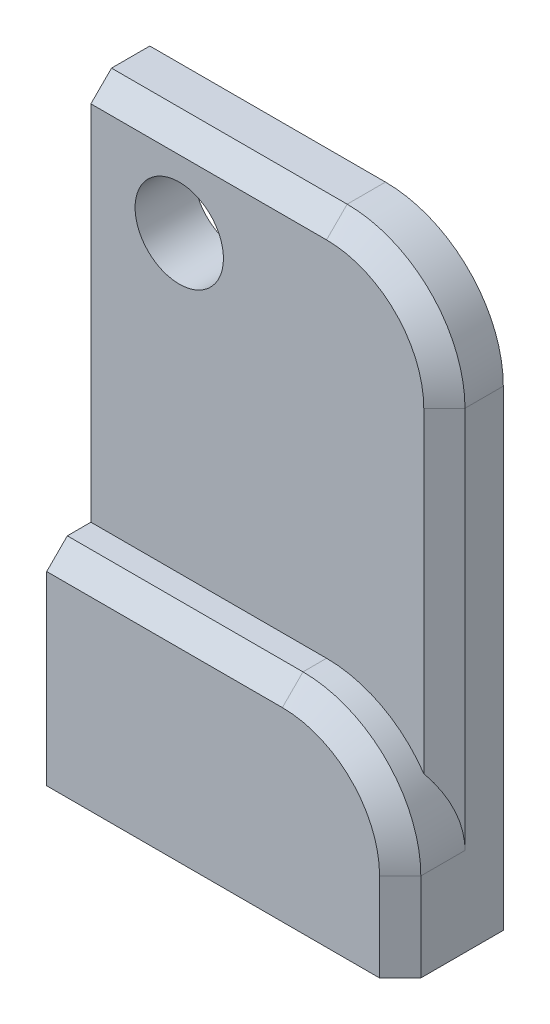
ISO-10303-21;
HEADER;
FILE_DESCRIPTION(('STEP AP214'),'2;1');
FILE_NAME('part.step','',(''),(''),'','','');
FILE_SCHEMA(('AUTOMOTIVE_DESIGN { 1 0 10303 214 1 1 1 1 }'));
ENDSEC;
DATA;
#1=APPLICATION_CONTEXT('core data for automotive mechanical design processes');
#2=APPLICATION_PROTOCOL_DEFINITION('international standard','automotive_design',2000,#1);
#3=PRODUCT_CONTEXT('',#1,'mechanical');
#4=PRODUCT('Part','Part','',(#3));
#5=PRODUCT_RELATED_PRODUCT_CATEGORY('part','',(#4));
#6=PRODUCT_DEFINITION_FORMATION('','',#4);
#7=PRODUCT_DEFINITION_CONTEXT('part definition',#1,'design');
#8=PRODUCT_DEFINITION('design','',#6,#7);
#9=PRODUCT_DEFINITION_SHAPE('','',#8);
#10=(LENGTH_UNIT() NAMED_UNIT(*) SI_UNIT(.MILLI.,.METRE.));
#11=(NAMED_UNIT(*) PLANE_ANGLE_UNIT() SI_UNIT($,.RADIAN.));
#12=(NAMED_UNIT(*) SI_UNIT($,.STERADIAN.) SOLID_ANGLE_UNIT());
#13=UNCERTAINTY_MEASURE_WITH_UNIT(LENGTH_MEASURE(1.E-05),#10,'distance_accuracy_value','');
#14=(GEOMETRIC_REPRESENTATION_CONTEXT(3) GLOBAL_UNCERTAINTY_ASSIGNED_CONTEXT((#13)) GLOBAL_UNIT_ASSIGNED_CONTEXT((#10,
#11,#12)) REPRESENTATION_CONTEXT('',''));
#15=CARTESIAN_POINT('',(0.,0.,0.));
#16=DIRECTION('',(0.,0.,1.));
#17=DIRECTION('',(1.,0.,0.));
#18=AXIS2_PLACEMENT_3D('',#15,#16,#17);
#19=CARTESIAN_POINT('',(0.,0.,0.));
#20=DIRECTION('',(0.,0.,-1.));
#21=DIRECTION('',(-1.,0.,0.));
#22=AXIS2_PLACEMENT_3D('',#19,#20,#21);
#23=PLANE('',#22);
#24=DIRECTION('',(1.,0.,0.));
#25=VECTOR('',#24,1.);
#26=CARTESIAN_POINT('',(-60.,-100.,0.));
#27=LINE('',#26,#25);
#28=CARTESIAN_POINT('',(55.,-100.,0.));
#29=VERTEX_POINT('',#28);
#30=CARTESIAN_POINT('',(60.,-100.,0.));
#31=VERTEX_POINT('',#30);
#32=EDGE_CURVE('E330',#29,#31,#27,.T.);
#33=ORIENTED_EDGE('',*,*,#32,.F.);
#34=DIRECTION('',(0.,1.,0.));
#35=VECTOR('',#34,1.);
#36=CARTESIAN_POINT('',(55.,0.,0.));
#37=LINE('',#36,#35);
#38=CARTESIAN_POINT('',(55.,60.,0.));
#39=VERTEX_POINT('',#38);
#40=EDGE_CURVE('E257',#29,#39,#37,.T.);
#41=ORIENTED_EDGE('',*,*,#40,.T.);
#42=CARTESIAN_POINT('',(20.,60.,0.));
#43=DIRECTION('',(0.,0.,-1.));
#44=DIRECTION('',(-1.,0.,0.));
#45=AXIS2_PLACEMENT_3D('',#42,#43,#44);
#46=CIRCLE('',#45,35.);
#47=CARTESIAN_POINT('',(20.,95.,0.));
#48=VERTEX_POINT('',#47);
#49=EDGE_CURVE('E258',#48,#39,#46,.T.);
#50=ORIENTED_EDGE('',*,*,#49,.F.);
#51=DIRECTION('',(-1.,0.,0.));
#52=VECTOR('',#51,1.);
#53=CARTESIAN_POINT('',(0.,95.,0.));
#54=LINE('',#53,#52);
#55=CARTESIAN_POINT('',(-55.,95.,0.));
#56=VERTEX_POINT('',#55);
#57=EDGE_CURVE('E253',#48,#56,#54,.T.);
#58=ORIENTED_EDGE('',*,*,#57,.T.);
#59=DIRECTION('',(0.,-1.,0.));
#60=VECTOR('',#59,1.);
#61=CARTESIAN_POINT('',(-55.,0.,0.));
#62=LINE('',#61,#60);
#63=CARTESIAN_POINT('',(-55.,-100.,0.));
#64=VERTEX_POINT('',#63);
#65=EDGE_CURVE('E250',#56,#64,#62,.T.);
#66=ORIENTED_EDGE('',*,*,#65,.T.);
#67=CARTESIAN_POINT('',(-60.,-100.,0.));
#68=VERTEX_POINT('',#67);
#69=EDGE_CURVE('E319',#68,#64,#27,.T.);
#70=ORIENTED_EDGE('',*,*,#69,.F.);
#71=DIRECTION('',(0.,-1.,0.));
#72=VECTOR('',#71,1.);
#73=CARTESIAN_POINT('',(-60.,-100.,0.));
#74=LINE('',#73,#72);
#75=CARTESIAN_POINT('',(-60.,100.,0.));
#76=VERTEX_POINT('',#75);
#77=EDGE_CURVE('E327',#76,#68,#74,.T.);
#78=ORIENTED_EDGE('',*,*,#77,.F.);
#79=DIRECTION('',(-1.,0.,0.));
#80=VECTOR('',#79,1.);
#81=CARTESIAN_POINT('',(-60.,100.,0.));
#82=LINE('',#81,#80);
#83=CARTESIAN_POINT('',(20.,100.,0.));
#84=VERTEX_POINT('',#83);
#85=EDGE_CURVE('E323',#84,#76,#82,.T.);
#86=ORIENTED_EDGE('',*,*,#85,.F.);
#87=CARTESIAN_POINT('',(20.,60.,0.));
#88=DIRECTION('',(0.,0.,-1.));
#89=DIRECTION('',(-1.,0.,0.));
#90=AXIS2_PLACEMENT_3D('',#87,#88,#89);
#91=CIRCLE('',#90,40.);
#92=CARTESIAN_POINT('',(60.,60.,0.));
#93=VERTEX_POINT('',#92);
#94=EDGE_CURVE('E358',#84,#93,#91,.T.);
#95=ORIENTED_EDGE('',*,*,#94,.T.);
#96=DIRECTION('',(0.,1.,0.));
#97=VECTOR('',#96,1.);
#98=CARTESIAN_POINT('',(60.,-100.,0.));
#99=LINE('',#98,#97);
#100=EDGE_CURVE('E314',#31,#93,#99,.T.);
#101=ORIENTED_EDGE('',*,*,#100,.F.);
#102=EDGE_LOOP('',(#33,#41,#50,#58,#66,#70,#78,#86,#95,#101));
#103=FACE_BOUND('',#102,.T.);
#104=ADVANCED_FACE('F47',(#103),#23,.T.);
#105=CARTESIAN_POINT('',(0.,0.,20.));
#106=DIRECTION('',(0.,0.,-1.));
#107=DIRECTION('',(-1.,0.,0.));
#108=AXIS2_PLACEMENT_3D('',#105,#106,#107);
#109=PLANE('',#108);
#110=CARTESIAN_POINT('',(-30.,70.,20.));
#111=DIRECTION('',(0.,0.,1.));
#112=DIRECTION('',(1.,0.,0.));
#113=AXIS2_PLACEMENT_3D('',#110,#111,#112);
#114=CIRCLE('',#113,15.);
#115=CARTESIAN_POINT('',(-15.,70.,20.));
#116=VERTEX_POINT('',#115);
#117=EDGE_CURVE('E295',#116,#116,#114,.T.);
#118=ORIENTED_EDGE('',*,*,#117,.F.);
#119=EDGE_LOOP('',(#118));
#120=FACE_BOUND('',#119,.T.);
#121=CARTESIAN_POINT('',(20.,-70.,20.));
#122=DIRECTION('',(0.,0.,-1.));
#123=DIRECTION('',(-1.,0.,0.));
#124=AXIS2_PLACEMENT_3D('',#121,#122,#123);
#125=CIRCLE('',#124,40.);
#126=CARTESIAN_POINT('',(20.,-30.,20.));
#127=VERTEX_POINT('',#126);
#128=CARTESIAN_POINT('',(53.,-47.3946908890854,20.));
#129=VERTEX_POINT('',#128);
#130=EDGE_CURVE('E361',#127,#129,#125,.T.);
#131=ORIENTED_EDGE('',*,*,#130,.T.);
#132=DIRECTION('',(0.,1.,0.));
#133=VECTOR('',#132,1.);
#134=CARTESIAN_POINT('',(53.,0.,20.));
#135=LINE('',#134,#133);
#136=CARTESIAN_POINT('',(53.,60.,20.));
#137=VERTEX_POINT('',#136);
#138=EDGE_CURVE('E403',#129,#137,#135,.T.);
#139=ORIENTED_EDGE('',*,*,#138,.T.);
#140=CARTESIAN_POINT('',(20.,60.,20.));
#141=DIRECTION('',(0.,0.,-1.));
#142=DIRECTION('',(-1.,0.,0.));
#143=AXIS2_PLACEMENT_3D('',#140,#141,#142);
#144=CIRCLE('',#143,33.);
#145=CARTESIAN_POINT('',(20.,93.,20.));
#146=VERTEX_POINT('',#145);
#147=EDGE_CURVE('E400',#137,#146,#144,.F.);
#148=ORIENTED_EDGE('',*,*,#147,.T.);
#149=DIRECTION('',(-1.,0.,0.));
#150=VECTOR('',#149,1.);
#151=CARTESIAN_POINT('',(0.,93.,20.));
#152=LINE('',#151,#150);
#153=CARTESIAN_POINT('',(-60.,93.,20.));
#154=VERTEX_POINT('',#153);
#155=EDGE_CURVE('E397',#146,#154,#152,.T.);
#156=ORIENTED_EDGE('',*,*,#155,.T.);
#157=DIRECTION('',(0.,-1.,0.));
#158=VECTOR('',#157,1.);
#159=CARTESIAN_POINT('',(-60.,-100.,20.));
#160=LINE('',#159,#158);
#161=CARTESIAN_POINT('',(-60.,-30.,20.));
#162=VERTEX_POINT('',#161);
#163=EDGE_CURVE('E315',#154,#162,#160,.T.);
#164=ORIENTED_EDGE('',*,*,#163,.T.);
#165=DIRECTION('',(-1.,0.,0.));
#166=VECTOR('',#165,1.);
#167=CARTESIAN_POINT('',(-60.,-30.,20.));
#168=LINE('',#167,#166);
#169=EDGE_CURVE('E294',#127,#162,#168,.T.);
#170=ORIENTED_EDGE('',*,*,#169,.F.);
#171=EDGE_LOOP('',(#131,#139,#148,#156,#164,#170));
#172=FACE_BOUND('',#171,.T.);
#173=ADVANCED_FACE('F534',(#120,#172),#109,.F.);
#174=CARTESIAN_POINT('',(60.,-100.,20.));
#175=DIRECTION('',(-1.,0.,0.));
#176=DIRECTION('',(0.,0.,1.));
#177=AXIS2_PLACEMENT_3D('',#174,#175,#176);
#178=PLANE('',#177);
#179=DIRECTION('',(0.,0.,-1.));
#180=VECTOR('',#179,1.);
#181=CARTESIAN_POINT('',(60.,-70.,20.));
#182=LINE('',#181,#180);
#183=CARTESIAN_POINT('',(60.,-70.,13.));
#184=VERTEX_POINT('',#183);
#185=CARTESIAN_POINT('',(60.,-70.,28.));
#186=VERTEX_POINT('',#185);
#187=EDGE_CURVE('E351',#184,#186,#182,.F.);
#188=ORIENTED_EDGE('',*,*,#187,.T.);
#189=DIRECTION('',(0.,-1.,0.));
#190=VECTOR('',#189,1.);
#191=CARTESIAN_POINT('',(60.,-100.,28.));
#192=LINE('',#191,#190);
#193=CARTESIAN_POINT('',(60.,-100.,28.));
#194=VERTEX_POINT('',#193);
#195=EDGE_CURVE('E379',#186,#194,#192,.T.);
#196=ORIENTED_EDGE('',*,*,#195,.T.);
#197=DIRECTION('',(0.,0.,-1.));
#198=VECTOR('',#197,1.);
#199=CARTESIAN_POINT('',(60.,-100.,20.));
#200=LINE('',#199,#198);
#201=EDGE_CURVE('E318',#194,#31,#200,.T.);
#202=ORIENTED_EDGE('',*,*,#201,.T.);
#203=ORIENTED_EDGE('',*,*,#100,.T.);
#204=DIRECTION('',(0.,0.,-1.));
#205=VECTOR('',#204,1.);
#206=CARTESIAN_POINT('',(60.,60.,20.));
#207=LINE('',#206,#205);
#208=CARTESIAN_POINT('',(60.,60.,13.));
#209=VERTEX_POINT('',#208);
#210=EDGE_CURVE('E347',#93,#209,#207,.F.);
#211=ORIENTED_EDGE('',*,*,#210,.T.);
#212=DIRECTION('',(0.,-1.,0.));
#213=VECTOR('',#212,1.);
#214=CARTESIAN_POINT('',(60.,-100.,13.));
#215=LINE('',#214,#213);
#216=EDGE_CURVE('E375',#209,#184,#215,.T.);
#217=ORIENTED_EDGE('',*,*,#216,.T.);
#218=EDGE_LOOP('',(#188,#196,#202,#203,#211,#217));
#219=FACE_BOUND('',#218,.T.);
#220=ADVANCED_FACE('F541',(#219),#178,.F.);
#221=CARTESIAN_POINT('',(-60.,100.,20.));
#222=DIRECTION('',(0.,-1.,0.));
#223=DIRECTION('',(0.,0.,-1.));
#224=AXIS2_PLACEMENT_3D('',#221,#222,#223);
#225=PLANE('',#224);
#226=DIRECTION('',(0.,0.,-1.));
#227=VECTOR('',#226,1.);
#228=CARTESIAN_POINT('',(-60.,100.,20.));
#229=LINE('',#228,#227);
#230=CARTESIAN_POINT('',(-60.,100.,13.));
#231=VERTEX_POINT('',#230);
#232=EDGE_CURVE('E341',#231,#76,#229,.T.);
#233=ORIENTED_EDGE('',*,*,#232,.F.);
#234=DIRECTION('',(1.,0.,0.));
#235=VECTOR('',#234,1.);
#236=CARTESIAN_POINT('',(-60.,100.,13.));
#237=LINE('',#236,#235);
#238=CARTESIAN_POINT('',(20.,100.,13.));
#239=VERTEX_POINT('',#238);
#240=EDGE_CURVE('E58',#231,#239,#237,.T.);
#241=ORIENTED_EDGE('',*,*,#240,.T.);
#242=DIRECTION('',(0.,0.,-1.));
#243=VECTOR('',#242,1.);
#244=CARTESIAN_POINT('',(20.,100.,20.));
#245=LINE('',#244,#243);
#246=EDGE_CURVE('E355',#239,#84,#245,.T.);
#247=ORIENTED_EDGE('',*,*,#246,.T.);
#248=ORIENTED_EDGE('',*,*,#85,.T.);
#249=EDGE_LOOP('',(#233,#241,#247,#248));
#250=FACE_BOUND('',#249,.T.);
#251=ADVANCED_FACE('F595',(#250),#225,.F.);
#252=CARTESIAN_POINT('',(-60.,-100.,20.));
#253=DIRECTION('',(1.,0.,0.));
#254=DIRECTION('',(0.,0.,-1.));
#255=AXIS2_PLACEMENT_3D('',#252,#253,#254);
#256=PLANE('',#255);
#257=DIRECTION('',(0.,-1.,0.));
#258=VECTOR('',#257,1.);
#259=CARTESIAN_POINT('',(-60.,-100.,35.));
#260=LINE('',#259,#258);
#261=CARTESIAN_POINT('',(-60.,-37.,35.));
#262=VERTEX_POINT('',#261);
#263=CARTESIAN_POINT('',(-60.,-100.,35.));
#264=VERTEX_POINT('',#263);
#265=EDGE_CURVE('E300',#262,#264,#260,.T.);
#266=ORIENTED_EDGE('',*,*,#265,.F.);
#267=DIRECTION('',(0.,-0.707106781186546,0.707106781186549));
#268=VECTOR('',#267,1.);
#269=CARTESIAN_POINT('',(-60.,-37.,35.));
#270=LINE('',#269,#268);
#271=CARTESIAN_POINT('',(-60.,-30.,28.));
#272=VERTEX_POINT('',#271);
#273=EDGE_CURVE('E391',#262,#272,#270,.F.);
#274=ORIENTED_EDGE('',*,*,#273,.T.);
#275=DIRECTION('',(0.,0.,-1.));
#276=VECTOR('',#275,1.);
#277=CARTESIAN_POINT('',(-60.,-30.,35.));
#278=LINE('',#277,#276);
#279=EDGE_CURVE('E307',#272,#162,#278,.T.);
#280=ORIENTED_EDGE('',*,*,#279,.T.);
#281=ORIENTED_EDGE('',*,*,#163,.F.);
#282=DIRECTION('',(0.,-0.707106781186546,0.707106781186549));
#283=VECTOR('',#282,1.);
#284=CARTESIAN_POINT('',(-60.,93.,20.));
#285=LINE('',#284,#283);
#286=EDGE_CURVE('E388',#154,#231,#285,.F.);
#287=ORIENTED_EDGE('',*,*,#286,.T.);
#288=ORIENTED_EDGE('',*,*,#232,.T.);
#289=ORIENTED_EDGE('',*,*,#77,.T.);
#290=DIRECTION('',(0.,0.,-1.));
#291=VECTOR('',#290,1.);
#292=CARTESIAN_POINT('',(-60.,-100.,20.));
#293=LINE('',#292,#291);
#294=EDGE_CURVE('E337',#264,#68,#293,.T.);
#295=ORIENTED_EDGE('',*,*,#294,.F.);
#296=EDGE_LOOP('',(#266,#274,#280,#281,#287,#288,#289,#295));
#297=FACE_BOUND('',#296,.T.);
#298=ADVANCED_FACE('F557',(#297),#256,.F.);
#299=CARTESIAN_POINT('',(-60.,-100.,20.));
#300=DIRECTION('',(0.,1.,0.));
#301=DIRECTION('',(0.,0.,1.));
#302=AXIS2_PLACEMENT_3D('',#299,#300,#301);
#303=PLANE('',#302);
#304=DIRECTION('',(0.707106781186546,0.,-0.707106781186549));
#305=VECTOR('',#304,1.);
#306=CARTESIAN_POINT('',(49.4644660940672,-100.,31.4644660940673));
#307=LINE('',#306,#305);
#308=CARTESIAN_POINT('',(55.,-100.,25.9289321881345));
#309=VERTEX_POINT('',#308);
#310=CARTESIAN_POINT('',(50.9289321881345,-100.,30.));
#311=VERTEX_POINT('',#310);
#312=EDGE_CURVE('E271',#309,#311,#307,.F.);
#313=ORIENTED_EDGE('',*,*,#312,.F.);
#314=DIRECTION('',(0.,0.,-1.));
#315=VECTOR('',#314,1.);
#316=CARTESIAN_POINT('',(55.,-100.,20.));
#317=LINE('',#316,#315);
#318=EDGE_CURVE('E267',#309,#29,#317,.T.);
#319=ORIENTED_EDGE('',*,*,#318,.T.);
#320=ORIENTED_EDGE('',*,*,#32,.T.);
#321=ORIENTED_EDGE('',*,*,#201,.F.);
#322=DIRECTION('',(0.707106781186546,0.,-0.707106781186549));
#323=VECTOR('',#322,1.);
#324=CARTESIAN_POINT('',(53.,-100.,35.));
#325=LINE('',#324,#323);
#326=CARTESIAN_POINT('',(53.,-100.,35.));
#327=VERTEX_POINT('',#326);
#328=EDGE_CURVE('E382',#194,#327,#325,.F.);
#329=ORIENTED_EDGE('',*,*,#328,.T.);
#330=DIRECTION('',(1.,0.,0.));
#331=VECTOR('',#330,1.);
#332=CARTESIAN_POINT('',(-60.,-100.,35.));
#333=LINE('',#332,#331);
#334=EDGE_CURVE('E303',#264,#327,#333,.T.);
#335=ORIENTED_EDGE('',*,*,#334,.F.);
#336=ORIENTED_EDGE('',*,*,#294,.T.);
#337=ORIENTED_EDGE('',*,*,#69,.T.);
#338=DIRECTION('',(0.,0.,-1.));
#339=VECTOR('',#338,1.);
#340=CARTESIAN_POINT('',(-55.,-100.,20.));
#341=LINE('',#340,#339);
#342=CARTESIAN_POINT('',(-55.,-100.,30.));
#343=VERTEX_POINT('',#342);
#344=EDGE_CURVE('E66',#343,#64,#341,.T.);
#345=ORIENTED_EDGE('',*,*,#344,.F.);
#346=DIRECTION('',(1.,0.,0.));
#347=VECTOR('',#346,1.);
#348=CARTESIAN_POINT('',(0.,-100.,30.));
#349=LINE('',#348,#347);
#350=EDGE_CURVE('E276',#343,#311,#349,.T.);
#351=ORIENTED_EDGE('',*,*,#350,.T.);
#352=EDGE_LOOP('',(#313,#319,#320,#321,#329,#335,#336,#337,#345,#351));
#353=FACE_BOUND('',#352,.T.);
#354=ADVANCED_FACE('F548',(#353),#303,.F.);
#355=CARTESIAN_POINT('',(-30.,70.,0.));
#356=DIRECTION('',(0.,0.,-1.));
#357=DIRECTION('',(-1.,0.,0.));
#358=AXIS2_PLACEMENT_3D('',#355,#356,#357);
#359=CIRCLE('',#358,20.);
#360=CARTESIAN_POINT('',(-50.,70.,0.));
#361=VERTEX_POINT('',#360);
#362=EDGE_CURVE('E284',#361,#361,#359,.F.);
#363=ORIENTED_EDGE('',*,*,#362,.F.);
#364=EDGE_LOOP('',(#363));
#365=FACE_BOUND('',#364,.T.);
#366=CARTESIAN_POINT('',(-30.,70.,0.));
#367=DIRECTION('',(0.,0.,1.));
#368=DIRECTION('',(1.,0.,0.));
#369=AXIS2_PLACEMENT_3D('',#366,#367,#368);
#370=CIRCLE('',#369,15.);
#371=CARTESIAN_POINT('',(-15.,70.,0.));
#372=VERTEX_POINT('',#371);
#373=EDGE_CURVE('E290',#372,#372,#370,.T.);
#374=ORIENTED_EDGE('',*,*,#373,.T.);
#375=EDGE_LOOP('',(#374));
#376=FACE_BOUND('',#375,.T.);
#377=ADVANCED_FACE('F537',(#365,#376),#23,.T.);
#378=CARTESIAN_POINT('',(-60.,-30.,35.));
#379=DIRECTION('',(0.,-1.,0.));
#380=DIRECTION('',(0.,0.,-1.));
#381=AXIS2_PLACEMENT_3D('',#378,#379,#380);
#382=PLANE('',#381);
#383=ORIENTED_EDGE('',*,*,#279,.F.);
#384=DIRECTION('',(1.,0.,0.));
#385=VECTOR('',#384,1.);
#386=CARTESIAN_POINT('',(-60.,-30.,28.));
#387=LINE('',#386,#385);
#388=CARTESIAN_POINT('',(20.,-30.,28.));
#389=VERTEX_POINT('',#388);
#390=EDGE_CURVE('E394',#272,#389,#387,.T.);
#391=ORIENTED_EDGE('',*,*,#390,.T.);
#392=DIRECTION('',(0.,0.,-1.));
#393=VECTOR('',#392,1.);
#394=CARTESIAN_POINT('',(20.,-30.,35.));
#395=LINE('',#394,#393);
#396=EDGE_CURVE('E344',#389,#127,#395,.T.);
#397=ORIENTED_EDGE('',*,*,#396,.T.);
#398=ORIENTED_EDGE('',*,*,#169,.T.);
#399=EDGE_LOOP('',(#383,#391,#397,#398));
#400=FACE_BOUND('',#399,.T.);
#401=ADVANCED_FACE('F547',(#400),#382,.F.);
#402=CARTESIAN_POINT('',(0.,0.,35.));
#403=DIRECTION('',(0.,0.,-1.));
#404=DIRECTION('',(-1.,0.,0.));
#405=AXIS2_PLACEMENT_3D('',#402,#403,#404);
#406=PLANE('',#405);
#407=ORIENTED_EDGE('',*,*,#334,.T.);
#408=DIRECTION('',(0.,1.,0.));
#409=VECTOR('',#408,1.);
#410=CARTESIAN_POINT('',(53.,0.,35.));
#411=LINE('',#410,#409);
#412=CARTESIAN_POINT('',(53.,-70.,35.));
#413=VERTEX_POINT('',#412);
#414=EDGE_CURVE('E371',#327,#413,#411,.T.);
#415=ORIENTED_EDGE('',*,*,#414,.T.);
#416=CARTESIAN_POINT('',(20.,-70.,35.));
#417=DIRECTION('',(0.,0.,-1.));
#418=DIRECTION('',(-1.,0.,0.));
#419=AXIS2_PLACEMENT_3D('',#416,#417,#418);
#420=CIRCLE('',#419,33.);
#421=CARTESIAN_POINT('',(20.,-37.,35.));
#422=VERTEX_POINT('',#421);
#423=EDGE_CURVE('E368',#413,#422,#420,.F.);
#424=ORIENTED_EDGE('',*,*,#423,.T.);
#425=DIRECTION('',(-1.,0.,0.));
#426=VECTOR('',#425,1.);
#427=CARTESIAN_POINT('',(0.,-37.,35.));
#428=LINE('',#427,#426);
#429=EDGE_CURVE('E365',#422,#262,#428,.T.);
#430=ORIENTED_EDGE('',*,*,#429,.T.);
#431=ORIENTED_EDGE('',*,*,#265,.T.);
#432=EDGE_LOOP('',(#407,#415,#424,#430,#431));
#433=FACE_BOUND('',#432,.T.);
#434=ADVANCED_FACE('F554',(#433),#406,.F.);
#435=CARTESIAN_POINT('',(-30.,70.,0.));
#436=DIRECTION('',(0.,0.,1.));
#437=DIRECTION('',(1.,0.,0.));
#438=AXIS2_PLACEMENT_3D('',#435,#436,#437);
#439=CYLINDRICAL_SURFACE('',#438,15.);
#440=ORIENTED_EDGE('',*,*,#373,.F.);
#441=EDGE_LOOP('',(#440));
#442=FACE_BOUND('',#441,.T.);
#443=ORIENTED_EDGE('',*,*,#117,.T.);
#444=EDGE_LOOP('',(#443));
#445=FACE_BOUND('',#444,.T.);
#446=ADVANCED_FACE('F563',(#442,#445),#439,.F.);
#447=CARTESIAN_POINT('',(20.,-70.,35.));
#448=DIRECTION('',(0.,0.,-1.));
#449=DIRECTION('',(-1.,0.,0.));
#450=AXIS2_PLACEMENT_3D('',#447,#448,#449);
#451=CYLINDRICAL_SURFACE('',#450,40.);
#452=ORIENTED_EDGE('',*,*,#396,.F.);
#453=CARTESIAN_POINT('',(20.,-70.,28.));
#454=DIRECTION('',(0.,0.,-1.));
#455=DIRECTION('',(-1.,0.,0.));
#456=AXIS2_PLACEMENT_3D('',#453,#454,#455);
#457=CIRCLE('',#456,40.);
#458=EDGE_CURVE('E385',#389,#186,#457,.T.);
#459=ORIENTED_EDGE('',*,*,#458,.T.);
#460=ORIENTED_EDGE('',*,*,#187,.F.);
#461=CARTESIAN_POINT('',(20.,-70.,53.0000000000001));
#462=DIRECTION('',(-0.707106781186549,0.,-0.707106781186546));
#463=DIRECTION('',(0.707106781186546,0.,-0.707106781186549));
#464=AXIS2_PLACEMENT_3D('',#461,#462,#463);
#465=ELLIPSE('',#464,56.5685424949239,40.);
#466=EDGE_CURVE('E11',#184,#129,#465,.F.);
#467=ORIENTED_EDGE('',*,*,#466,.T.);
#468=ORIENTED_EDGE('',*,*,#130,.F.);
#469=EDGE_LOOP('',(#452,#459,#460,#467,#468));
#470=FACE_BOUND('',#469,.T.);
#471=ADVANCED_FACE('F566',(#470),#451,.T.);
#472=CARTESIAN_POINT('',(20.,60.,20.));
#473=DIRECTION('',(0.,0.,-1.));
#474=DIRECTION('',(-1.,0.,0.));
#475=AXIS2_PLACEMENT_3D('',#472,#473,#474);
#476=CYLINDRICAL_SURFACE('',#475,40.);
#477=ORIENTED_EDGE('',*,*,#246,.F.);
#478=CARTESIAN_POINT('',(20.,60.,13.));
#479=DIRECTION('',(0.,0.,-1.));
#480=DIRECTION('',(-1.,0.,0.));
#481=AXIS2_PLACEMENT_3D('',#478,#479,#480);
#482=CIRCLE('',#481,40.);
#483=EDGE_CURVE('E407',#239,#209,#482,.T.);
#484=ORIENTED_EDGE('',*,*,#483,.T.);
#485=ORIENTED_EDGE('',*,*,#210,.F.);
#486=ORIENTED_EDGE('',*,*,#94,.F.);
#487=EDGE_LOOP('',(#477,#484,#485,#486));
#488=FACE_BOUND('',#487,.T.);
#489=ADVANCED_FACE('F583',(#488),#476,.T.);
#490=CARTESIAN_POINT('',(0.,-37.,35.));
#491=DIRECTION('',(0.,-0.707106781186549,-0.707106781186546));
#492=DIRECTION('',(-1.,0.,0.));
#493=AXIS2_PLACEMENT_3D('',#490,#491,#492);
#494=PLANE('',#493);
#495=ORIENTED_EDGE('',*,*,#273,.F.);
#496=ORIENTED_EDGE('',*,*,#429,.F.);
#497=DIRECTION('',(0.,-0.707106781186546,0.707106781186549));
#498=VECTOR('',#497,1.);
#499=CARTESIAN_POINT('',(20.,-30.,28.));
#500=LINE('',#499,#498);
#501=EDGE_CURVE('E299',#389,#422,#500,.T.);
#502=ORIENTED_EDGE('',*,*,#501,.F.);
#503=ORIENTED_EDGE('',*,*,#390,.F.);
#504=EDGE_LOOP('',(#495,#496,#502,#503));
#505=FACE_BOUND('',#504,.T.);
#506=ADVANCED_FACE('F615',(#505),#494,.F.);
#507=CARTESIAN_POINT('',(20.,-70.,35.));
#508=DIRECTION('',(0.,0.,-1.));
#509=DIRECTION('',(-1.,0.,0.));
#510=AXIS2_PLACEMENT_3D('',#507,#508,#509);
#511=CONICAL_SURFACE('',#510,33.,0.785398163397446);
#512=ORIENTED_EDGE('',*,*,#501,.T.);
#513=ORIENTED_EDGE('',*,*,#423,.F.);
#514=DIRECTION('',(-0.707106781186546,0.,0.707106781186549));
#515=VECTOR('',#514,1.);
#516=CARTESIAN_POINT('',(60.,-70.,28.));
#517=LINE('',#516,#515);
#518=EDGE_CURVE('E412',#186,#413,#517,.T.);
#519=ORIENTED_EDGE('',*,*,#518,.F.);
#520=ORIENTED_EDGE('',*,*,#458,.F.);
#521=EDGE_LOOP('',(#512,#513,#519,#520));
#522=FACE_BOUND('',#521,.T.);
#523=ADVANCED_FACE('F610',(#522),#511,.T.);
#524=CARTESIAN_POINT('',(53.,0.,35.));
#525=DIRECTION('',(-0.707106781186549,0.,-0.707106781186546));
#526=DIRECTION('',(0.,1.,0.));
#527=AXIS2_PLACEMENT_3D('',#524,#525,#526);
#528=PLANE('',#527);
#529=ORIENTED_EDGE('',*,*,#328,.F.);
#530=ORIENTED_EDGE('',*,*,#195,.F.);
#531=ORIENTED_EDGE('',*,*,#518,.T.);
#532=ORIENTED_EDGE('',*,*,#414,.F.);
#533=EDGE_LOOP('',(#529,#530,#531,#532));
#534=FACE_BOUND('',#533,.T.);
#535=ADVANCED_FACE('F606',(#534),#528,.F.);
#536=CARTESIAN_POINT('',(0.,93.,20.));
#537=DIRECTION('',(0.,-0.707106781186549,-0.707106781186546));
#538=DIRECTION('',(-1.,0.,0.));
#539=AXIS2_PLACEMENT_3D('',#536,#537,#538);
#540=PLANE('',#539);
#541=ORIENTED_EDGE('',*,*,#286,.F.);
#542=ORIENTED_EDGE('',*,*,#155,.F.);
#543=DIRECTION('',(0.,-0.707106781186546,0.707106781186549));
#544=VECTOR('',#543,1.);
#545=CARTESIAN_POINT('',(20.,100.,13.));
#546=LINE('',#545,#544);
#547=EDGE_CURVE('E52',#239,#146,#546,.T.);
#548=ORIENTED_EDGE('',*,*,#547,.F.);
#549=ORIENTED_EDGE('',*,*,#240,.F.);
#550=EDGE_LOOP('',(#541,#542,#548,#549));
#551=FACE_BOUND('',#550,.T.);
#552=ADVANCED_FACE('F50',(#551),#540,.F.);
#553=CARTESIAN_POINT('',(20.,60.,20.));
#554=DIRECTION('',(0.,0.,-1.));
#555=DIRECTION('',(-1.,0.,0.));
#556=AXIS2_PLACEMENT_3D('',#553,#554,#555);
#557=CONICAL_SURFACE('',#556,33.,0.785398163397446);
#558=ORIENTED_EDGE('',*,*,#547,.T.);
#559=ORIENTED_EDGE('',*,*,#147,.F.);
#560=DIRECTION('',(-0.707106781186546,0.,0.707106781186549));
#561=VECTOR('',#560,1.);
#562=CARTESIAN_POINT('',(60.,60.,13.));
#563=LINE('',#562,#561);
#564=EDGE_CURVE('E417',#209,#137,#563,.T.);
#565=ORIENTED_EDGE('',*,*,#564,.F.);
#566=ORIENTED_EDGE('',*,*,#483,.F.);
#567=EDGE_LOOP('',(#558,#559,#565,#566));
#568=FACE_BOUND('',#567,.T.);
#569=ADVANCED_FACE('F588',(#568),#557,.T.);
#570=CARTESIAN_POINT('',(53.,0.,20.));
#571=DIRECTION('',(-0.707106781186549,0.,-0.707106781186546));
#572=DIRECTION('',(0.,1.,0.));
#573=AXIS2_PLACEMENT_3D('',#570,#571,#572);
#574=PLANE('',#573);
#575=ORIENTED_EDGE('',*,*,#466,.F.);
#576=ORIENTED_EDGE('',*,*,#216,.F.);
#577=ORIENTED_EDGE('',*,*,#564,.T.);
#578=ORIENTED_EDGE('',*,*,#138,.F.);
#579=EDGE_LOOP('',(#575,#576,#577,#578));
#580=FACE_BOUND('',#579,.T.);
#581=ADVANCED_FACE('F575',(#580),#574,.F.);
#582=CARTESIAN_POINT('',(0.,0.,15.));
#583=DIRECTION('',(0.,0.,-1.));
#584=DIRECTION('',(-1.,0.,0.));
#585=AXIS2_PLACEMENT_3D('',#582,#583,#584);
#586=PLANE('',#585);
#587=CARTESIAN_POINT('',(-30.,70.,15.));
#588=DIRECTION('',(0.,0.,-1.));
#589=DIRECTION('',(-1.,0.,0.));
#590=AXIS2_PLACEMENT_3D('',#587,#588,#589);
#591=CIRCLE('',#590,20.);
#592=CARTESIAN_POINT('',(-50.,70.,15.));
#593=VERTEX_POINT('',#592);
#594=EDGE_CURVE('E289',#593,#593,#591,.F.);
#595=ORIENTED_EDGE('',*,*,#594,.T.);
#596=EDGE_LOOP('',(#595));
#597=FACE_BOUND('',#596,.T.);
#598=CARTESIAN_POINT('',(20.,-70.,15.));
#599=DIRECTION('',(0.,0.,-1.));
#600=DIRECTION('',(-1.,0.,0.));
#601=AXIS2_PLACEMENT_3D('',#598,#599,#600);
#602=CIRCLE('',#601,35.);
#603=CARTESIAN_POINT('',(20.,-35.,15.));
#604=VERTEX_POINT('',#603);
#605=CARTESIAN_POINT('',(50.9289321881345,-53.6170468565104,15.));
#606=VERTEX_POINT('',#605);
#607=EDGE_CURVE('E261',#604,#606,#602,.T.);
#608=ORIENTED_EDGE('',*,*,#607,.F.);
#609=DIRECTION('',(-1.,0.,0.));
#610=VECTOR('',#609,1.);
#611=CARTESIAN_POINT('',(0.,-35.,15.));
#612=LINE('',#611,#610);
#613=CARTESIAN_POINT('',(-55.,-35.,15.));
#614=VERTEX_POINT('',#613);
#615=EDGE_CURVE('E288',#604,#614,#612,.T.);
#616=ORIENTED_EDGE('',*,*,#615,.T.);
#617=DIRECTION('',(0.,-1.,0.));
#618=VECTOR('',#617,1.);
#619=CARTESIAN_POINT('',(-55.,0.,15.));
#620=LINE('',#619,#618);
#621=CARTESIAN_POINT('',(-55.,90.9289321881345,15.));
#622=VERTEX_POINT('',#621);
#623=EDGE_CURVE('E231',#622,#614,#620,.T.);
#624=ORIENTED_EDGE('',*,*,#623,.F.);
#625=DIRECTION('',(1.,0.,0.));
#626=VECTOR('',#625,1.);
#627=CARTESIAN_POINT('',(0.,90.9289321881345,15.));
#628=LINE('',#627,#626);
#629=CARTESIAN_POINT('',(20.,90.9289321881345,15.));
#630=VERTEX_POINT('',#629);
#631=EDGE_CURVE('E225',#630,#622,#628,.F.);
#632=ORIENTED_EDGE('',*,*,#631,.F.);
#633=CARTESIAN_POINT('',(20.,60.,15.));
#634=DIRECTION('',(0.,0.,-1.));
#635=DIRECTION('',(-1.,0.,0.));
#636=AXIS2_PLACEMENT_3D('',#633,#634,#635);
#637=CIRCLE('',#636,30.9289321881345);
#638=CARTESIAN_POINT('',(50.9289321881345,60.,15.));
#639=VERTEX_POINT('',#638);
#640=EDGE_CURVE('E212',#639,#630,#637,.F.);
#641=ORIENTED_EDGE('',*,*,#640,.F.);
#642=DIRECTION('',(0.,-1.,0.));
#643=VECTOR('',#642,1.);
#644=CARTESIAN_POINT('',(50.9289321881345,0.,15.));
#645=LINE('',#644,#643);
#646=EDGE_CURVE('E224',#606,#639,#645,.F.);
#647=ORIENTED_EDGE('',*,*,#646,.F.);
#648=EDGE_LOOP('',(#608,#616,#624,#632,#641,#647));
#649=FACE_BOUND('',#648,.T.);
#650=ADVANCED_FACE('F229',(#597,#649),#586,.T.);
#651=CARTESIAN_POINT('',(55.,-100.,20.));
#652=DIRECTION('',(-1.,0.,0.));
#653=DIRECTION('',(0.,0.,1.));
#654=AXIS2_PLACEMENT_3D('',#651,#652,#653);
#655=PLANE('',#654);
#656=DIRECTION('',(0.,0.,1.));
#657=VECTOR('',#656,1.);
#658=CARTESIAN_POINT('',(55.,-70.,20.));
#659=LINE('',#658,#657);
#660=CARTESIAN_POINT('',(55.,-70.,10.9289321881345));
#661=VERTEX_POINT('',#660);
#662=CARTESIAN_POINT('',(55.,-70.,25.9289321881345));
#663=VERTEX_POINT('',#662);
#664=EDGE_CURVE('E484',#661,#663,#659,.T.);
#665=ORIENTED_EDGE('',*,*,#664,.F.);
#666=DIRECTION('',(0.,1.,0.));
#667=VECTOR('',#666,1.);
#668=CARTESIAN_POINT('',(55.,0.,10.9289321881345));
#669=LINE('',#668,#667);
#670=CARTESIAN_POINT('',(55.,60.,10.9289321881345));
#671=VERTEX_POINT('',#670);
#672=EDGE_CURVE('E453',#671,#661,#669,.F.);
#673=ORIENTED_EDGE('',*,*,#672,.F.);
#674=DIRECTION('',(0.,0.,1.));
#675=VECTOR('',#674,1.);
#676=CARTESIAN_POINT('',(55.,60.,20.));
#677=LINE('',#676,#675);
#678=EDGE_CURVE('E480',#39,#671,#677,.T.);
#679=ORIENTED_EDGE('',*,*,#678,.F.);
#680=ORIENTED_EDGE('',*,*,#40,.F.);
#681=ORIENTED_EDGE('',*,*,#318,.F.);
#682=DIRECTION('',(0.,1.,0.));
#683=VECTOR('',#682,1.);
#684=CARTESIAN_POINT('',(55.,0.,25.9289321881345));
#685=LINE('',#684,#683);
#686=EDGE_CURVE('E275',#663,#309,#685,.F.);
#687=ORIENTED_EDGE('',*,*,#686,.F.);
#688=EDGE_LOOP('',(#665,#673,#679,#680,#681,#687));
#689=FACE_BOUND('',#688,.T.);
#690=ADVANCED_FACE('F687',(#689),#655,.T.);
#691=CARTESIAN_POINT('',(-60.,95.,20.));
#692=DIRECTION('',(0.,-1.,0.));
#693=DIRECTION('',(0.,0.,-1.));
#694=AXIS2_PLACEMENT_3D('',#691,#692,#693);
#695=PLANE('',#694);
#696=DIRECTION('',(0.,0.,-1.));
#697=VECTOR('',#696,1.);
#698=CARTESIAN_POINT('',(-55.,95.,20.));
#699=LINE('',#698,#697);
#700=CARTESIAN_POINT('',(-55.,95.,10.9289321881345));
#701=VERTEX_POINT('',#700);
#702=EDGE_CURVE('E283',#701,#56,#699,.T.);
#703=ORIENTED_EDGE('',*,*,#702,.T.);
#704=ORIENTED_EDGE('',*,*,#57,.F.);
#705=DIRECTION('',(0.,0.,-1.));
#706=VECTOR('',#705,1.);
#707=CARTESIAN_POINT('',(20.,95.,20.));
#708=LINE('',#707,#706);
#709=CARTESIAN_POINT('',(20.,95.,10.9289321881345));
#710=VERTEX_POINT('',#709);
#711=EDGE_CURVE('E262',#710,#48,#708,.T.);
#712=ORIENTED_EDGE('',*,*,#711,.F.);
#713=DIRECTION('',(-1.,0.,0.));
#714=VECTOR('',#713,1.);
#715=CARTESIAN_POINT('',(0.,95.,10.9289321881345));
#716=LINE('',#715,#714);
#717=EDGE_CURVE('E239',#701,#710,#716,.F.);
#718=ORIENTED_EDGE('',*,*,#717,.F.);
#719=EDGE_LOOP('',(#703,#704,#712,#718));
#720=FACE_BOUND('',#719,.T.);
#721=ADVANCED_FACE('F697',(#720),#695,.T.);
#722=CARTESIAN_POINT('',(-55.,-100.,20.));
#723=DIRECTION('',(1.,0.,0.));
#724=DIRECTION('',(0.,0.,-1.));
#725=AXIS2_PLACEMENT_3D('',#722,#723,#724);
#726=PLANE('',#725);
#727=DIRECTION('',(0.,-1.,0.));
#728=VECTOR('',#727,1.);
#729=CARTESIAN_POINT('',(-55.,0.,30.));
#730=LINE('',#729,#728);
#731=CARTESIAN_POINT('',(-55.,-39.0710678118655,30.));
#732=VERTEX_POINT('',#731);
#733=EDGE_CURVE('E280',#732,#343,#730,.T.);
#734=ORIENTED_EDGE('',*,*,#733,.T.);
#735=ORIENTED_EDGE('',*,*,#344,.T.);
#736=ORIENTED_EDGE('',*,*,#65,.F.);
#737=ORIENTED_EDGE('',*,*,#702,.F.);
#738=DIRECTION('',(0.,-0.707106781186546,0.707106781186549));
#739=VECTOR('',#738,1.);
#740=CARTESIAN_POINT('',(-55.,89.4644660940673,16.4644660940673));
#741=LINE('',#740,#739);
#742=EDGE_CURVE('E499',#622,#701,#741,.F.);
#743=ORIENTED_EDGE('',*,*,#742,.F.);
#744=ORIENTED_EDGE('',*,*,#623,.T.);
#745=DIRECTION('',(0.,0.,-1.));
#746=VECTOR('',#745,1.);
#747=CARTESIAN_POINT('',(-55.,-35.,20.));
#748=LINE('',#747,#746);
#749=CARTESIAN_POINT('',(-55.,-35.,25.9289321881345));
#750=VERTEX_POINT('',#749);
#751=EDGE_CURVE('E266',#750,#614,#748,.T.);
#752=ORIENTED_EDGE('',*,*,#751,.F.);
#753=DIRECTION('',(0.,-0.707106781186546,0.707106781186549));
#754=VECTOR('',#753,1.);
#755=CARTESIAN_POINT('',(-55.,-40.5355339059328,31.4644660940673));
#756=LINE('',#755,#754);
#757=EDGE_CURVE('E441',#732,#750,#756,.F.);
#758=ORIENTED_EDGE('',*,*,#757,.F.);
#759=EDGE_LOOP('',(#734,#735,#736,#737,#743,#744,#752,#758));
#760=FACE_BOUND('',#759,.T.);
#761=ADVANCED_FACE('F707',(#760),#726,.T.);
#762=CARTESIAN_POINT('',(-60.,-35.,35.));
#763=DIRECTION('',(0.,-1.,0.));
#764=DIRECTION('',(0.,0.,-1.));
#765=AXIS2_PLACEMENT_3D('',#762,#763,#764);
#766=PLANE('',#765);
#767=ORIENTED_EDGE('',*,*,#751,.T.);
#768=ORIENTED_EDGE('',*,*,#615,.F.);
#769=DIRECTION('',(0.,0.,-1.));
#770=VECTOR('',#769,1.);
#771=CARTESIAN_POINT('',(20.,-35.,35.));
#772=LINE('',#771,#770);
#773=CARTESIAN_POINT('',(20.,-35.,25.9289321881345));
#774=VERTEX_POINT('',#773);
#775=EDGE_CURVE('E476',#774,#604,#772,.T.);
#776=ORIENTED_EDGE('',*,*,#775,.F.);
#777=DIRECTION('',(-1.,0.,0.));
#778=VECTOR('',#777,1.);
#779=CARTESIAN_POINT('',(0.,-35.,25.9289321881345));
#780=LINE('',#779,#778);
#781=EDGE_CURVE('E235',#750,#774,#780,.F.);
#782=ORIENTED_EDGE('',*,*,#781,.F.);
#783=EDGE_LOOP('',(#767,#768,#776,#782));
#784=FACE_BOUND('',#783,.T.);
#785=ADVANCED_FACE('F477',(#784),#766,.T.);
#786=CARTESIAN_POINT('',(0.,0.,30.));
#787=DIRECTION('',(0.,0.,-1.));
#788=DIRECTION('',(-1.,0.,0.));
#789=AXIS2_PLACEMENT_3D('',#786,#787,#788);
#790=PLANE('',#789);
#791=ORIENTED_EDGE('',*,*,#350,.F.);
#792=ORIENTED_EDGE('',*,*,#733,.F.);
#793=DIRECTION('',(1.,0.,0.));
#794=VECTOR('',#793,1.);
#795=CARTESIAN_POINT('',(0.,-39.0710678118655,30.));
#796=LINE('',#795,#794);
#797=CARTESIAN_POINT('',(20.,-39.0710678118655,30.));
#798=VERTEX_POINT('',#797);
#799=EDGE_CURVE('E442',#798,#732,#796,.F.);
#800=ORIENTED_EDGE('',*,*,#799,.F.);
#801=CARTESIAN_POINT('',(20.,-70.,30.));
#802=DIRECTION('',(0.,0.,-1.));
#803=DIRECTION('',(-1.,0.,0.));
#804=AXIS2_PLACEMENT_3D('',#801,#802,#803);
#805=CIRCLE('',#804,30.9289321881345);
#806=CARTESIAN_POINT('',(50.9289321881345,-70.,30.));
#807=VERTEX_POINT('',#806);
#808=EDGE_CURVE('E445',#807,#798,#805,.F.);
#809=ORIENTED_EDGE('',*,*,#808,.F.);
#810=DIRECTION('',(0.,-1.,0.));
#811=VECTOR('',#810,1.);
#812=CARTESIAN_POINT('',(50.9289321881345,0.,30.));
#813=LINE('',#812,#811);
#814=EDGE_CURVE('E449',#311,#807,#813,.F.);
#815=ORIENTED_EDGE('',*,*,#814,.F.);
#816=EDGE_LOOP('',(#791,#792,#800,#809,#815));
#817=FACE_BOUND('',#816,.T.);
#818=ADVANCED_FACE('F466',(#817),#790,.T.);
#819=CARTESIAN_POINT('',(-30.,70.,0.));
#820=DIRECTION('',(0.,0.,1.));
#821=DIRECTION('',(1.,0.,0.));
#822=AXIS2_PLACEMENT_3D('',#819,#820,#821);
#823=CYLINDRICAL_SURFACE('',#822,20.);
#824=ORIENTED_EDGE('',*,*,#362,.T.);
#825=EDGE_LOOP('',(#824));
#826=FACE_BOUND('',#825,.T.);
#827=ORIENTED_EDGE('',*,*,#594,.F.);
#828=EDGE_LOOP('',(#827));
#829=FACE_BOUND('',#828,.T.);
#830=ADVANCED_FACE('F521',(#826,#829),#823,.T.);
#831=CARTESIAN_POINT('',(20.,-70.,35.));
#832=DIRECTION('',(0.,0.,-1.));
#833=DIRECTION('',(-1.,0.,0.));
#834=AXIS2_PLACEMENT_3D('',#831,#832,#833);
#835=CYLINDRICAL_SURFACE('',#834,35.);
#836=ORIENTED_EDGE('',*,*,#775,.T.);
#837=ORIENTED_EDGE('',*,*,#607,.T.);
#838=CARTESIAN_POINT('',(20.,-70.,45.9289321881346));
#839=DIRECTION('',(-0.707106781186549,0.,-0.707106781186546));
#840=DIRECTION('',(0.707106781186546,0.,-0.707106781186549));
#841=AXIS2_PLACEMENT_3D('',#838,#839,#840);
#842=ELLIPSE('',#841,49.4974746830584,35.);
#843=EDGE_CURVE('E419',#661,#606,#842,.F.);
#844=ORIENTED_EDGE('',*,*,#843,.F.);
#845=ORIENTED_EDGE('',*,*,#664,.T.);
#846=CARTESIAN_POINT('',(20.,-70.,25.9289321881345));
#847=DIRECTION('',(0.,0.,-1.));
#848=DIRECTION('',(-1.,0.,0.));
#849=AXIS2_PLACEMENT_3D('',#846,#847,#848);
#850=CIRCLE('',#849,35.);
#851=EDGE_CURVE('E274',#774,#663,#850,.T.);
#852=ORIENTED_EDGE('',*,*,#851,.F.);
#853=EDGE_LOOP('',(#836,#837,#844,#845,#852));
#854=FACE_BOUND('',#853,.T.);
#855=ADVANCED_FACE('F523',(#854),#835,.F.);
#856=CARTESIAN_POINT('',(20.,60.,20.));
#857=DIRECTION('',(0.,0.,-1.));
#858=DIRECTION('',(-1.,0.,0.));
#859=AXIS2_PLACEMENT_3D('',#856,#857,#858);
#860=CYLINDRICAL_SURFACE('',#859,35.);
#861=ORIENTED_EDGE('',*,*,#711,.T.);
#862=ORIENTED_EDGE('',*,*,#49,.T.);
#863=ORIENTED_EDGE('',*,*,#678,.T.);
#864=CARTESIAN_POINT('',(20.,60.,10.9289321881345));
#865=DIRECTION('',(0.,0.,-1.));
#866=DIRECTION('',(-1.,0.,0.));
#867=AXIS2_PLACEMENT_3D('',#864,#865,#866);
#868=CIRCLE('',#867,35.);
#869=EDGE_CURVE('E434',#710,#671,#868,.T.);
#870=ORIENTED_EDGE('',*,*,#869,.F.);
#871=EDGE_LOOP('',(#861,#862,#863,#870));
#872=FACE_BOUND('',#871,.T.);
#873=ADVANCED_FACE('F530',(#872),#860,.F.);
#874=CARTESIAN_POINT('',(0.,-40.5355339059328,31.4644660940673));
#875=DIRECTION('',(0.,-0.707106781186549,-0.707106781186546));
#876=DIRECTION('',(-1.,0.,0.));
#877=AXIS2_PLACEMENT_3D('',#874,#875,#876);
#878=PLANE('',#877);
#879=ORIENTED_EDGE('',*,*,#757,.T.);
#880=ORIENTED_EDGE('',*,*,#781,.T.);
#881=DIRECTION('',(0.,0.707106781186546,-0.707106781186549));
#882=VECTOR('',#881,1.);
#883=CARTESIAN_POINT('',(20.,-40.5355339059328,31.4644660940673));
#884=LINE('',#883,#882);
#885=EDGE_CURVE('E246',#774,#798,#884,.F.);
#886=ORIENTED_EDGE('',*,*,#885,.T.);
#887=ORIENTED_EDGE('',*,*,#799,.T.);
#888=EDGE_LOOP('',(#879,#880,#886,#887));
#889=FACE_BOUND('',#888,.T.);
#890=ADVANCED_FACE('F469',(#889),#878,.T.);
#891=CARTESIAN_POINT('',(20.,-70.,31.4644660940673));
#892=DIRECTION('',(0.,0.,-1.));
#893=DIRECTION('',(-1.,0.,0.));
#894=AXIS2_PLACEMENT_3D('',#891,#892,#893);
#895=CONICAL_SURFACE('',#894,29.4644660940672,0.785398163397446);
#896=ORIENTED_EDGE('',*,*,#885,.F.);
#897=ORIENTED_EDGE('',*,*,#851,.T.);
#898=DIRECTION('',(0.707106781186546,0.,-0.707106781186549));
#899=VECTOR('',#898,1.);
#900=CARTESIAN_POINT('',(49.4644660940672,-70.,31.4644660940673));
#901=LINE('',#900,#899);
#902=EDGE_CURVE('E242',#663,#807,#901,.F.);
#903=ORIENTED_EDGE('',*,*,#902,.T.);
#904=ORIENTED_EDGE('',*,*,#808,.T.);
#905=EDGE_LOOP('',(#896,#897,#903,#904));
#906=FACE_BOUND('',#905,.T.);
#907=ADVANCED_FACE('F459',(#906),#895,.F.);
#908=CARTESIAN_POINT('',(49.4644660940672,0.,31.4644660940673));
#909=DIRECTION('',(-0.707106781186549,0.,-0.707106781186546));
#910=DIRECTION('',(0.,1.,0.));
#911=AXIS2_PLACEMENT_3D('',#908,#909,#910);
#912=PLANE('',#911);
#913=ORIENTED_EDGE('',*,*,#312,.T.);
#914=ORIENTED_EDGE('',*,*,#814,.T.);
#915=ORIENTED_EDGE('',*,*,#902,.F.);
#916=ORIENTED_EDGE('',*,*,#686,.T.);
#917=EDGE_LOOP('',(#913,#914,#915,#916));
#918=FACE_BOUND('',#917,.T.);
#919=ADVANCED_FACE('F767',(#918),#912,.T.);
#920=CARTESIAN_POINT('',(0.,89.4644660940673,16.4644660940673));
#921=DIRECTION('',(0.,-0.707106781186549,-0.707106781186546));
#922=DIRECTION('',(-1.,0.,0.));
#923=AXIS2_PLACEMENT_3D('',#920,#921,#922);
#924=PLANE('',#923);
#925=ORIENTED_EDGE('',*,*,#742,.T.);
#926=ORIENTED_EDGE('',*,*,#717,.T.);
#927=DIRECTION('',(0.,0.707106781186546,-0.707106781186549));
#928=VECTOR('',#927,1.);
#929=CARTESIAN_POINT('',(20.,89.4644660940672,16.4644660940673));
#930=LINE('',#929,#928);
#931=EDGE_CURVE('E216',#710,#630,#930,.F.);
#932=ORIENTED_EDGE('',*,*,#931,.T.);
#933=ORIENTED_EDGE('',*,*,#631,.T.);
#934=EDGE_LOOP('',(#925,#926,#932,#933));
#935=FACE_BOUND('',#934,.T.);
#936=ADVANCED_FACE('F237',(#935),#924,.T.);
#937=CARTESIAN_POINT('',(20.,60.,16.4644660940673));
#938=DIRECTION('',(0.,0.,-1.));
#939=DIRECTION('',(-1.,0.,0.));
#940=AXIS2_PLACEMENT_3D('',#937,#938,#939);
#941=CONICAL_SURFACE('',#940,29.4644660940672,0.785398163397446);
#942=ORIENTED_EDGE('',*,*,#931,.F.);
#943=ORIENTED_EDGE('',*,*,#869,.T.);
#944=DIRECTION('',(0.707106781186546,0.,-0.707106781186549));
#945=VECTOR('',#944,1.);
#946=CARTESIAN_POINT('',(49.4644660940672,60.,16.4644660940673));
#947=LINE('',#946,#945);
#948=EDGE_CURVE('E219',#671,#639,#947,.F.);
#949=ORIENTED_EDGE('',*,*,#948,.T.);
#950=ORIENTED_EDGE('',*,*,#640,.T.);
#951=EDGE_LOOP('',(#942,#943,#949,#950));
#952=FACE_BOUND('',#951,.T.);
#953=ADVANCED_FACE('F214',(#952),#941,.F.);
#954=CARTESIAN_POINT('',(49.4644660940672,0.,16.4644660940673));
#955=DIRECTION('',(-0.707106781186549,0.,-0.707106781186546));
#956=DIRECTION('',(0.,1.,0.));
#957=AXIS2_PLACEMENT_3D('',#954,#955,#956);
#958=PLANE('',#957);
#959=ORIENTED_EDGE('',*,*,#843,.T.);
#960=ORIENTED_EDGE('',*,*,#646,.T.);
#961=ORIENTED_EDGE('',*,*,#948,.F.);
#962=ORIENTED_EDGE('',*,*,#672,.T.);
#963=EDGE_LOOP('',(#959,#960,#961,#962));
#964=FACE_BOUND('',#963,.T.);
#965=ADVANCED_FACE('F793',(#964),#958,.T.);
#966=CLOSED_SHELL('',(#104,#173,#220,#251,#298,#354,#377,#401,#434,#446,#471,#489,#506,#523,
#535,#552,#569,#581,#650,#690,#721,#761,#785,#818,#830,#855,#873,#890,#907,#919,#936,#953,#965));
#967=MANIFOLD_SOLID_BREP('B2',#966);
#968=ADVANCED_BREP_SHAPE_REPRESENTATION('',(#18,#967),#14);
#969=SHAPE_DEFINITION_REPRESENTATION(#9,#968);
ENDSEC;
END-ISO-10303-21;
